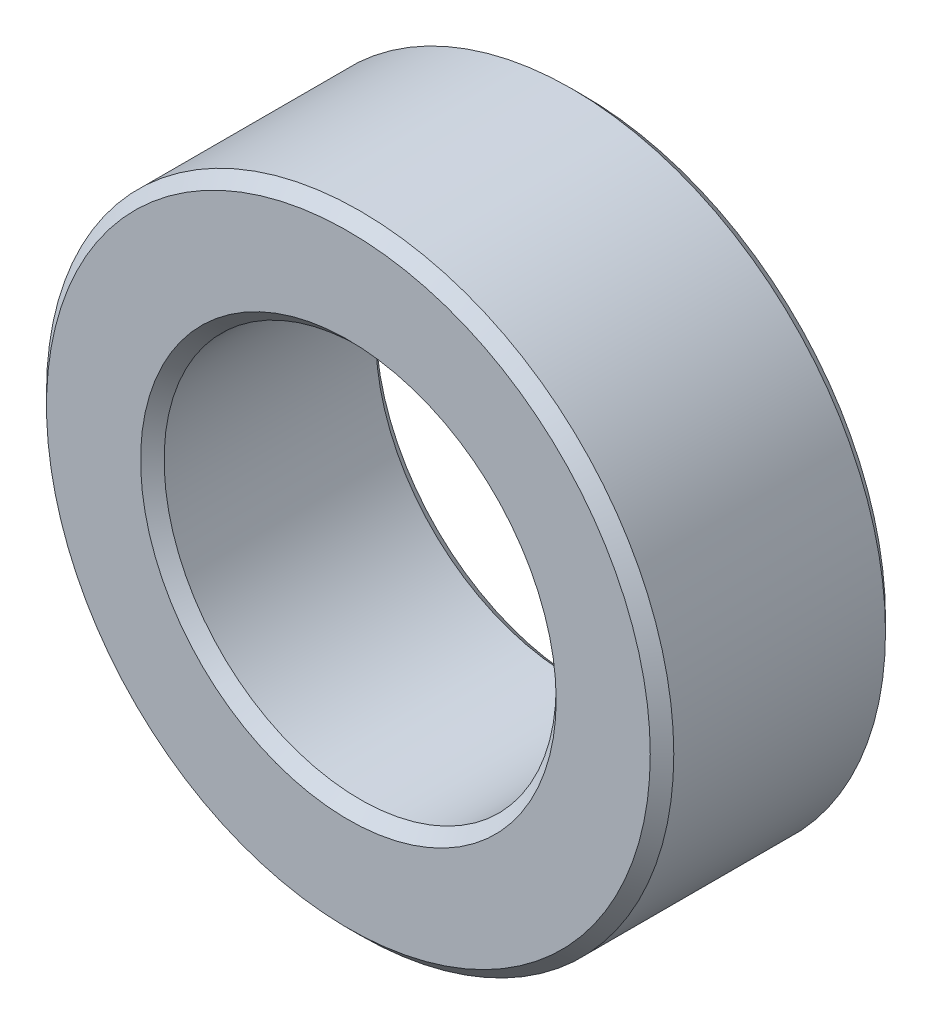
ISO-10303-21;
HEADER;
FILE_DESCRIPTION(('STEP AP214'),'2;1');
FILE_NAME('part.step','',(''),(''),'','','');
FILE_SCHEMA(('AUTOMOTIVE_DESIGN { 1 0 10303 214 1 1 1 1 }'));
ENDSEC;
DATA;
#1=APPLICATION_CONTEXT('core data for automotive mechanical design processes');
#2=APPLICATION_PROTOCOL_DEFINITION('international standard','automotive_design',2000,#1);
#3=PRODUCT_CONTEXT('',#1,'mechanical');
#4=PRODUCT('Part','Part','',(#3));
#5=PRODUCT_RELATED_PRODUCT_CATEGORY('part','',(#4));
#6=PRODUCT_DEFINITION_FORMATION('','',#4);
#7=PRODUCT_DEFINITION_CONTEXT('part definition',#1,'design');
#8=PRODUCT_DEFINITION('design','',#6,#7);
#9=PRODUCT_DEFINITION_SHAPE('','',#8);
#10=(LENGTH_UNIT() NAMED_UNIT(*) SI_UNIT(.MILLI.,.METRE.));
#11=(NAMED_UNIT(*) PLANE_ANGLE_UNIT() SI_UNIT($,.RADIAN.));
#12=(NAMED_UNIT(*) SI_UNIT($,.STERADIAN.) SOLID_ANGLE_UNIT());
#13=UNCERTAINTY_MEASURE_WITH_UNIT(LENGTH_MEASURE(1.E-05),#10,'distance_accuracy_value','');
#14=(GEOMETRIC_REPRESENTATION_CONTEXT(3) GLOBAL_UNCERTAINTY_ASSIGNED_CONTEXT((#13)) GLOBAL_UNIT_ASSIGNED_CONTEXT((#10,
#11,#12)) REPRESENTATION_CONTEXT('',''));
#15=CARTESIAN_POINT('',(0.,0.,0.));
#16=DIRECTION('',(0.,0.,1.));
#17=DIRECTION('',(1.,0.,0.));
#18=AXIS2_PLACEMENT_3D('',#15,#16,#17);
#19=CARTESIAN_POINT('',(0.,0.,-4.7625));
#20=DIRECTION('',(0.,0.,1.));
#21=DIRECTION('',(1.,0.,0.));
#22=AXIS2_PLACEMENT_3D('',#19,#20,#21);
#23=CYLINDRICAL_SURFACE('',#22,12.7);
#24=CARTESIAN_POINT('',(0.,0.,4.28625000000002));
#25=DIRECTION('',(0.,0.,1.));
#26=DIRECTION('',(1.,0.,0.));
#27=AXIS2_PLACEMENT_3D('',#24,#25,#26);
#28=CIRCLE('',#27,12.7);
#29=CARTESIAN_POINT('',(12.7,0.,4.28625000000002));
#30=VERTEX_POINT('',#29);
#31=EDGE_CURVE('E55',#30,#30,#28,.F.);
#32=CARTESIAN_POINT('',(0.,0.,-4.28624999999999));
#33=DIRECTION('',(0.,0.,1.));
#34=DIRECTION('',(1.,0.,0.));
#35=AXIS2_PLACEMENT_3D('',#32,#33,#34);
#36=CIRCLE('',#35,12.7);
#37=CARTESIAN_POINT('',(12.7,0.,-4.28624999999999));
#38=VERTEX_POINT('',#37);
#39=EDGE_CURVE('E58',#38,#38,#36,.T.);
#40=CARTESIAN_POINT('',(12.7,0.,4.28625000000002));
#41=CARTESIAN_POINT('',(12.7,0.,4.19695312500002));
#42=CARTESIAN_POINT('',(12.7,0.,4.10765625000002));
#43=CARTESIAN_POINT('',(12.7,0.,3.92906250000002));
#44=CARTESIAN_POINT('',(12.7,0.,3.83976562500002));
#45=CARTESIAN_POINT('',(12.7,0.,3.66117187500002));
#46=CARTESIAN_POINT('',(12.7,0.,3.57187500000002));
#47=CARTESIAN_POINT('',(12.7,0.,3.39328125000002));
#48=CARTESIAN_POINT('',(12.7,0.,3.30398437500002));
#49=CARTESIAN_POINT('',(12.7,0.,3.12539062500002));
#50=CARTESIAN_POINT('',(12.7,0.,3.03609375000002));
#51=CARTESIAN_POINT('',(12.7,0.,2.85750000000002));
#52=CARTESIAN_POINT('',(12.7,0.,2.76820312500002));
#53=CARTESIAN_POINT('',(12.7,0.,2.58960937500002));
#54=CARTESIAN_POINT('',(12.7,0.,2.50031250000002));
#55=CARTESIAN_POINT('',(12.7,0.,2.32171875000002));
#56=CARTESIAN_POINT('',(12.7,0.,2.23242187500002));
#57=CARTESIAN_POINT('',(12.7,0.,2.05382812500002));
#58=CARTESIAN_POINT('',(12.7,0.,1.96453125000002));
#59=CARTESIAN_POINT('',(12.7,0.,1.78593750000002));
#60=CARTESIAN_POINT('',(12.7,0.,1.69664062500002));
#61=CARTESIAN_POINT('',(12.7,0.,1.51804687500002));
#62=CARTESIAN_POINT('',(12.7,0.,1.42875000000002));
#63=CARTESIAN_POINT('',(12.7,0.,1.25015625000002));
#64=CARTESIAN_POINT('',(12.7,0.,1.16085937500002));
#65=CARTESIAN_POINT('',(12.7,0.,0.982265625000018));
#66=CARTESIAN_POINT('',(12.7,0.,0.892968750000018));
#67=CARTESIAN_POINT('',(12.7,0.,0.714375000000017));
#68=CARTESIAN_POINT('',(12.7,0.,0.625078125000017));
#69=CARTESIAN_POINT('',(12.7,0.,0.446484375000017));
#70=CARTESIAN_POINT('',(12.7,0.,0.357187500000017));
#71=CARTESIAN_POINT('',(12.7,0.,0.178593750000017));
#72=CARTESIAN_POINT('',(12.7,0.,0.0892968750000166));
#73=CARTESIAN_POINT('',(12.7,0.,-0.0892968749999836));
#74=CARTESIAN_POINT('',(12.7,0.,-0.178593749999984));
#75=CARTESIAN_POINT('',(12.7,0.,-0.357187499999984));
#76=CARTESIAN_POINT('',(12.7,0.,-0.446484374999984));
#77=CARTESIAN_POINT('',(12.7,0.,-0.625078124999984));
#78=CARTESIAN_POINT('',(12.7,0.,-0.714374999999984));
#79=CARTESIAN_POINT('',(12.7,0.,-0.892968749999984));
#80=CARTESIAN_POINT('',(12.7,0.,-0.982265624999984));
#81=CARTESIAN_POINT('',(12.7,0.,-1.16085937499998));
#82=CARTESIAN_POINT('',(12.7,0.,-1.25015624999998));
#83=CARTESIAN_POINT('',(12.7,0.,-1.42874999999998));
#84=CARTESIAN_POINT('',(12.7,0.,-1.51804687499998));
#85=CARTESIAN_POINT('',(12.7,0.,-1.69664062499999));
#86=CARTESIAN_POINT('',(12.7,0.,-1.78593749999999));
#87=CARTESIAN_POINT('',(12.7,0.,-1.96453124999999));
#88=CARTESIAN_POINT('',(12.7,0.,-2.05382812499998));
#89=CARTESIAN_POINT('',(12.7,0.,-2.23242187499998));
#90=CARTESIAN_POINT('',(12.7,0.,-2.32171874999999));
#91=CARTESIAN_POINT('',(12.7,0.,-2.50031249999999));
#92=CARTESIAN_POINT('',(12.7,0.,-2.58960937499999));
#93=CARTESIAN_POINT('',(12.7,0.,-2.76820312499999));
#94=CARTESIAN_POINT('',(12.7,0.,-2.85749999999999));
#95=CARTESIAN_POINT('',(12.7,0.,-3.03609374999999));
#96=CARTESIAN_POINT('',(12.7,0.,-3.12539062499999));
#97=CARTESIAN_POINT('',(12.7,0.,-3.30398437499999));
#98=CARTESIAN_POINT('',(12.7,0.,-3.39328124999999));
#99=CARTESIAN_POINT('',(12.7,0.,-3.57187499999999));
#100=CARTESIAN_POINT('',(12.7,0.,-3.66117187499999));
#101=CARTESIAN_POINT('',(12.7,0.,-3.83976562499999));
#102=CARTESIAN_POINT('',(12.7,0.,-3.92906249999999));
#103=CARTESIAN_POINT('',(12.7,0.,-4.10765624999999));
#104=CARTESIAN_POINT('',(12.7,0.,-4.19695312499999));
#105=CARTESIAN_POINT('',(12.7,0.,-4.28624999999999));
#106=B_SPLINE_CURVE_WITH_KNOTS('',3,(#40,#41,#42,#43,#44,#45,#46,#47,#48,#49,#50,#51,#52,#53,
#54,#55,#56,#57,#58,#59,#60,#61,#62,#63,#64,#65,#66,#67,#68,#69,#70,#71,#72,#73,#74,#75,#76,#77,
#78,#79,#80,#81,#82,#83,#84,#85,#86,#87,#88,#89,#90,#91,#92,#93,#94,#95,#96,#97,#98,#99,#100,
#101,#102,#103,#104,#105),.UNSPECIFIED.,.F.,.F.,(4,2,2,2,2,2,2,2,2,2,2,2,2,2,2,2,2,2,2,2,2,2,2,
2,2,2,2,2,2,2,2,2,4),(0.,0.267890624999999,0.535781250000001,0.803671875,1.0715625,1.339453125,
1.60734375,1.875234375,2.143125,2.411015625,2.67890625,2.946796875,3.2146875,3.482578125,
3.75046875,4.018359375,4.28625,4.554140625,4.82203125,5.089921875,5.3578125,5.62570312500001,
5.89359375000001,6.16148437500001,6.42937500000001,6.69726562500001,6.96515625000001,
7.23304687500001,7.50093750000001,7.76882812500001,8.03671875000001,8.30460937500001,
8.57250000000001),.UNSPECIFIED.);
#107=EDGE_CURVE('BSEAM35',#30,#38,#106,.T.);
#108=ORIENTED_EDGE('',*,*,#31,.T.);
#109=ORIENTED_EDGE('',*,*,#39,.T.);
#110=ORIENTED_EDGE('',*,*,#107,.T.);
#111=ORIENTED_EDGE('',*,*,#107,.F.);
#112=EDGE_LOOP('',(#108,#110,#109,#111));
#113=FACE_BOUND('',#112,.T.);
#114=ADVANCED_FACE('F35',(#113),#23,.T.);
#115=CARTESIAN_POINT('',(0.,0.,-4.7625));
#116=DIRECTION('',(0.,0.,1.));
#117=DIRECTION('',(1.,0.,0.));
#118=AXIS2_PLACEMENT_3D('',#115,#116,#117);
#119=PLANE('',#118);
#120=CARTESIAN_POINT('',(0.,0.,-4.7625));
#121=DIRECTION('',(0.,0.,1.));
#122=DIRECTION('',(1.,0.,0.));
#123=AXIS2_PLACEMENT_3D('',#120,#121,#122);
#124=CIRCLE('',#123,12.22375);
#125=CARTESIAN_POINT('',(12.22375,0.,-4.7625));
#126=VERTEX_POINT('',#125);
#127=EDGE_CURVE('E46',#126,#126,#124,.F.);
#128=ORIENTED_EDGE('',*,*,#127,.T.);
#129=EDGE_LOOP('',(#128));
#130=FACE_BOUND('',#129,.T.);
#131=CARTESIAN_POINT('',(0.,0.,-4.7625));
#132=DIRECTION('',(0.,0.,1.));
#133=DIRECTION('',(1.,0.,0.));
#134=AXIS2_PLACEMENT_3D('',#131,#132,#133);
#135=CIRCLE('',#134,8.41374999999999);
#136=CARTESIAN_POINT('',(8.41374999999999,0.,-4.7625));
#137=VERTEX_POINT('',#136);
#138=EDGE_CURVE('E50',#137,#137,#135,.T.);
#139=ORIENTED_EDGE('',*,*,#138,.T.);
#140=EDGE_LOOP('',(#139));
#141=FACE_BOUND('',#140,.T.);
#142=ADVANCED_FACE('F83',(#130,#141),#119,.F.);
#143=CARTESIAN_POINT('',(0.,0.,-4.7625));
#144=DIRECTION('',(0.,0.,1.));
#145=DIRECTION('',(1.,0.,0.));
#146=AXIS2_PLACEMENT_3D('',#143,#144,#145);
#147=CYLINDRICAL_SURFACE('',#146,7.9375);
#148=CARTESIAN_POINT('',(0.,0.,4.28624999999998));
#149=DIRECTION('',(0.,0.,1.));
#150=DIRECTION('',(1.,0.,0.));
#151=AXIS2_PLACEMENT_3D('',#148,#149,#150);
#152=CIRCLE('',#151,7.9375);
#153=CARTESIAN_POINT('',(7.9375,0.,4.28624999999998));
#154=VERTEX_POINT('',#153);
#155=EDGE_CURVE('E10',#154,#154,#152,.T.);
#156=CARTESIAN_POINT('',(0.,0.,-4.28625000000001));
#157=DIRECTION('',(0.,0.,1.));
#158=DIRECTION('',(1.,0.,0.));
#159=AXIS2_PLACEMENT_3D('',#156,#157,#158);
#160=CIRCLE('',#159,7.9375);
#161=CARTESIAN_POINT('',(7.9375,0.,-4.28625000000001));
#162=VERTEX_POINT('',#161);
#163=EDGE_CURVE('E42',#162,#162,#160,.F.);
#164=CARTESIAN_POINT('',(7.9375,0.,4.28624999999998));
#165=CARTESIAN_POINT('',(7.9375,0.,4.19695312499998));
#166=CARTESIAN_POINT('',(7.9375,0.,4.10765624999997));
#167=CARTESIAN_POINT('',(7.9375,0.,3.92906249999998));
#168=CARTESIAN_POINT('',(7.9375,0.,3.83976562499998));
#169=CARTESIAN_POINT('',(7.9375,0.,3.66117187499998));
#170=CARTESIAN_POINT('',(7.9375,0.,3.57187499999998));
#171=CARTESIAN_POINT('',(7.9375,0.,3.39328124999998));
#172=CARTESIAN_POINT('',(7.9375,0.,3.30398437499998));
#173=CARTESIAN_POINT('',(7.9375,0.,3.12539062499998));
#174=CARTESIAN_POINT('',(7.9375,0.,3.03609374999998));
#175=CARTESIAN_POINT('',(7.9375,0.,2.85749999999998));
#176=CARTESIAN_POINT('',(7.9375,0.,2.76820312499998));
#177=CARTESIAN_POINT('',(7.9375,0.,2.58960937499998));
#178=CARTESIAN_POINT('',(7.9375,0.,2.50031249999998));
#179=CARTESIAN_POINT('',(7.9375,0.,2.32171874999998));
#180=CARTESIAN_POINT('',(7.9375,0.,2.23242187499998));
#181=CARTESIAN_POINT('',(7.9375,0.,2.05382812499998));
#182=CARTESIAN_POINT('',(7.9375,0.,1.96453124999998));
#183=CARTESIAN_POINT('',(7.9375,0.,1.78593749999998));
#184=CARTESIAN_POINT('',(7.9375,0.,1.69664062499998));
#185=CARTESIAN_POINT('',(7.9375,0.,1.51804687499998));
#186=CARTESIAN_POINT('',(7.9375,0.,1.42874999999998));
#187=CARTESIAN_POINT('',(7.9375,0.,1.25015624999998));
#188=CARTESIAN_POINT('',(7.9375,0.,1.16085937499998));
#189=CARTESIAN_POINT('',(7.9375,0.,0.982265624999982));
#190=CARTESIAN_POINT('',(7.9375,0.,0.892968749999983));
#191=CARTESIAN_POINT('',(7.9375,0.,0.714374999999983));
#192=CARTESIAN_POINT('',(7.9375,0.,0.625078124999983));
#193=CARTESIAN_POINT('',(7.9375,0.,0.446484374999984));
#194=CARTESIAN_POINT('',(7.9375,0.,0.357187499999984));
#195=CARTESIAN_POINT('',(7.9375,0.,0.178593749999984));
#196=CARTESIAN_POINT('',(7.9375,0.,0.0892968749999842));
#197=CARTESIAN_POINT('',(7.9375,0.,-0.0892968750000154));
#198=CARTESIAN_POINT('',(7.9375,0.,-0.178593750000015));
#199=CARTESIAN_POINT('',(7.9375,0.,-0.357187500000015));
#200=CARTESIAN_POINT('',(7.9375,0.,-0.446484375000015));
#201=CARTESIAN_POINT('',(7.9375,0.,-0.625078125000014));
#202=CARTESIAN_POINT('',(7.9375,0.,-0.714375000000014));
#203=CARTESIAN_POINT('',(7.9375,0.,-0.892968750000014));
#204=CARTESIAN_POINT('',(7.9375,0.,-0.982265625000013));
#205=CARTESIAN_POINT('',(7.9375,0.,-1.16085937500001));
#206=CARTESIAN_POINT('',(7.9375,0.,-1.25015625000001));
#207=CARTESIAN_POINT('',(7.9375,0.,-1.42875000000001));
#208=CARTESIAN_POINT('',(7.9375,0.,-1.51804687500001));
#209=CARTESIAN_POINT('',(7.9375,0.,-1.69664062500001));
#210=CARTESIAN_POINT('',(7.9375,0.,-1.78593750000001));
#211=CARTESIAN_POINT('',(7.9375,0.,-1.96453125000001));
#212=CARTESIAN_POINT('',(7.9375,0.,-2.05382812500001));
#213=CARTESIAN_POINT('',(7.9375,0.,-2.23242187500001));
#214=CARTESIAN_POINT('',(7.9375,0.,-2.32171875000001));
#215=CARTESIAN_POINT('',(7.9375,0.,-2.50031250000001));
#216=CARTESIAN_POINT('',(7.9375,0.,-2.58960937500001));
#217=CARTESIAN_POINT('',(7.9375,0.,-2.76820312500001));
#218=CARTESIAN_POINT('',(7.9375,0.,-2.85750000000001));
#219=CARTESIAN_POINT('',(7.9375,0.,-3.03609375000001));
#220=CARTESIAN_POINT('',(7.9375,0.,-3.12539062500001));
#221=CARTESIAN_POINT('',(7.9375,0.,-3.30398437500001));
#222=CARTESIAN_POINT('',(7.9375,0.,-3.39328125000001));
#223=CARTESIAN_POINT('',(7.9375,0.,-3.57187500000001));
#224=CARTESIAN_POINT('',(7.9375,0.,-3.66117187500001));
#225=CARTESIAN_POINT('',(7.9375,0.,-3.83976562500001));
#226=CARTESIAN_POINT('',(7.9375,0.,-3.92906250000001));
#227=CARTESIAN_POINT('',(7.9375,0.,-4.10765625000001));
#228=CARTESIAN_POINT('',(7.9375,0.,-4.19695312500001));
#229=CARTESIAN_POINT('',(7.9375,0.,-4.28625000000001));
#230=B_SPLINE_CURVE_WITH_KNOTS('',3,(#164,#165,#166,#167,#168,#169,#170,#171,#172,#173,#174,
#175,#176,#177,#178,#179,#180,#181,#182,#183,#184,#185,#186,#187,#188,#189,#190,#191,#192,#193,
#194,#195,#196,#197,#198,#199,#200,#201,#202,#203,#204,#205,#206,#207,#208,#209,#210,#211,#212,
#213,#214,#215,#216,#217,#218,#219,#220,#221,#222,#223,#224,#225,#226,#227,#228,#229),
.UNSPECIFIED.,.F.,.F.,(4,2,2,2,2,2,2,2,2,2,2,2,2,2,2,2,2,2,2,2,2,2,2,2,2,2,2,2,2,2,2,2,4),(0.,
0.267890624999999,0.535781249999999,0.803671874999998,1.0715625,1.339453125,1.60734375,
1.875234375,2.143125,2.41101562499999,2.67890624999999,2.94679687499999,3.21468749999999,
3.48257812499999,3.75046874999999,4.01835937499999,4.28624999999999,4.55414062499999,
4.82203124999999,5.08992187499999,5.35781249999999,5.62570312499999,5.89359374999999,
6.16148437499999,6.42937499999999,6.69726562499998,6.96515624999998,7.23304687499998,
7.50093749999998,7.76882812499998,8.03671874999998,8.30460937499998,8.57249999999998),.UNSPECIFIED.);
#231=EDGE_CURVE('BSEAM89',#154,#162,#230,.T.);
#232=ORIENTED_EDGE('',*,*,#155,.T.);
#233=ORIENTED_EDGE('',*,*,#163,.T.);
#234=ORIENTED_EDGE('',*,*,#231,.T.);
#235=ORIENTED_EDGE('',*,*,#231,.F.);
#236=EDGE_LOOP('',(#232,#234,#233,#235));
#237=FACE_BOUND('',#236,.T.);
#238=ADVANCED_FACE('F89',(#237),#147,.F.);
#239=CARTESIAN_POINT('',(0.,0.,4.7625));
#240=DIRECTION('',(0.,0.,1.));
#241=DIRECTION('',(1.,0.,0.));
#242=AXIS2_PLACEMENT_3D('',#239,#240,#241);
#243=PLANE('',#242);
#244=CARTESIAN_POINT('',(0.,0.,4.7625));
#245=DIRECTION('',(0.,0.,1.));
#246=DIRECTION('',(1.,0.,0.));
#247=AXIS2_PLACEMENT_3D('',#244,#245,#246);
#248=CIRCLE('',#247,12.22375);
#249=CARTESIAN_POINT('',(12.22375,0.,4.7625));
#250=VERTEX_POINT('',#249);
#251=EDGE_CURVE('E61',#250,#250,#248,.T.);
#252=ORIENTED_EDGE('',*,*,#251,.T.);
#253=EDGE_LOOP('',(#252));
#254=FACE_BOUND('',#253,.T.);
#255=CARTESIAN_POINT('',(0.,0.,4.7625));
#256=DIRECTION('',(0.,0.,1.));
#257=DIRECTION('',(1.,0.,0.));
#258=AXIS2_PLACEMENT_3D('',#255,#256,#257);
#259=CIRCLE('',#258,8.41375000000003);
#260=CARTESIAN_POINT('',(8.41375000000003,0.,4.7625));
#261=VERTEX_POINT('',#260);
#262=EDGE_CURVE('E64',#261,#261,#259,.F.);
#263=ORIENTED_EDGE('',*,*,#262,.T.);
#264=EDGE_LOOP('',(#263));
#265=FACE_BOUND('',#264,.T.);
#266=ADVANCED_FACE('F68',(#254,#265),#243,.T.);
#267=CARTESIAN_POINT('',(0.,0.,4.7625));
#268=DIRECTION('',(0.,0.,-1.));
#269=DIRECTION('',(-1.,0.,0.));
#270=AXIS2_PLACEMENT_3D('',#267,#268,#269);
#271=CONICAL_SURFACE('',#270,12.22375,0.785398163397445);
#272=ORIENTED_EDGE('',*,*,#31,.F.);
#273=EDGE_LOOP('',(#272));
#274=FACE_BOUND('',#273,.T.);
#275=ORIENTED_EDGE('',*,*,#251,.F.);
#276=EDGE_LOOP('',(#275));
#277=FACE_BOUND('',#276,.T.);
#278=ADVANCED_FACE('F79',(#274,#277),#271,.T.);
#279=CARTESIAN_POINT('',(0.,0.,-4.28624999999999));
#280=DIRECTION('',(0.,0.,1.));
#281=DIRECTION('',(1.,0.,0.));
#282=AXIS2_PLACEMENT_3D('',#279,#280,#281);
#283=CONICAL_SURFACE('',#282,12.7,0.785398163397446);
#284=ORIENTED_EDGE('',*,*,#127,.F.);
#285=EDGE_LOOP('',(#284));
#286=FACE_BOUND('',#285,.T.);
#287=ORIENTED_EDGE('',*,*,#39,.F.);
#288=EDGE_LOOP('',(#287));
#289=FACE_BOUND('',#288,.T.);
#290=ADVANCED_FACE('F73',(#286,#289),#283,.T.);
#291=CARTESIAN_POINT('',(0.,0.,4.28624999999998));
#292=DIRECTION('',(0.,0.,1.));
#293=DIRECTION('',(1.,0.,0.));
#294=AXIS2_PLACEMENT_3D('',#291,#292,#293);
#295=CONICAL_SURFACE('',#294,7.9375,0.78539816339745);
#296=ORIENTED_EDGE('',*,*,#262,.F.);
#297=EDGE_LOOP('',(#296));
#298=FACE_BOUND('',#297,.T.);
#299=ORIENTED_EDGE('',*,*,#155,.F.);
#300=EDGE_LOOP('',(#299));
#301=FACE_BOUND('',#300,.T.);
#302=ADVANCED_FACE('F70',(#298,#301),#295,.F.);
#303=CARTESIAN_POINT('',(0.,0.,-4.7625));
#304=DIRECTION('',(0.,0.,-1.));
#305=DIRECTION('',(-1.,0.,0.));
#306=AXIS2_PLACEMENT_3D('',#303,#304,#305);
#307=CONICAL_SURFACE('',#306,8.41374999999999,0.785398163397446);
#308=ORIENTED_EDGE('',*,*,#163,.F.);
#309=EDGE_LOOP('',(#308));
#310=FACE_BOUND('',#309,.T.);
#311=ORIENTED_EDGE('',*,*,#138,.F.);
#312=EDGE_LOOP('',(#311));
#313=FACE_BOUND('',#312,.T.);
#314=ADVANCED_FACE('F37',(#310,#313),#307,.F.);
#315=CLOSED_SHELL('',(#114,#142,#238,#266,#278,#290,#302,#314));
#316=MANIFOLD_SOLID_BREP('B2',#315);
#317=ADVANCED_BREP_SHAPE_REPRESENTATION('',(#18,#316),#14);
#318=SHAPE_DEFINITION_REPRESENTATION(#9,#317);
ENDSEC;
END-ISO-10303-21;
